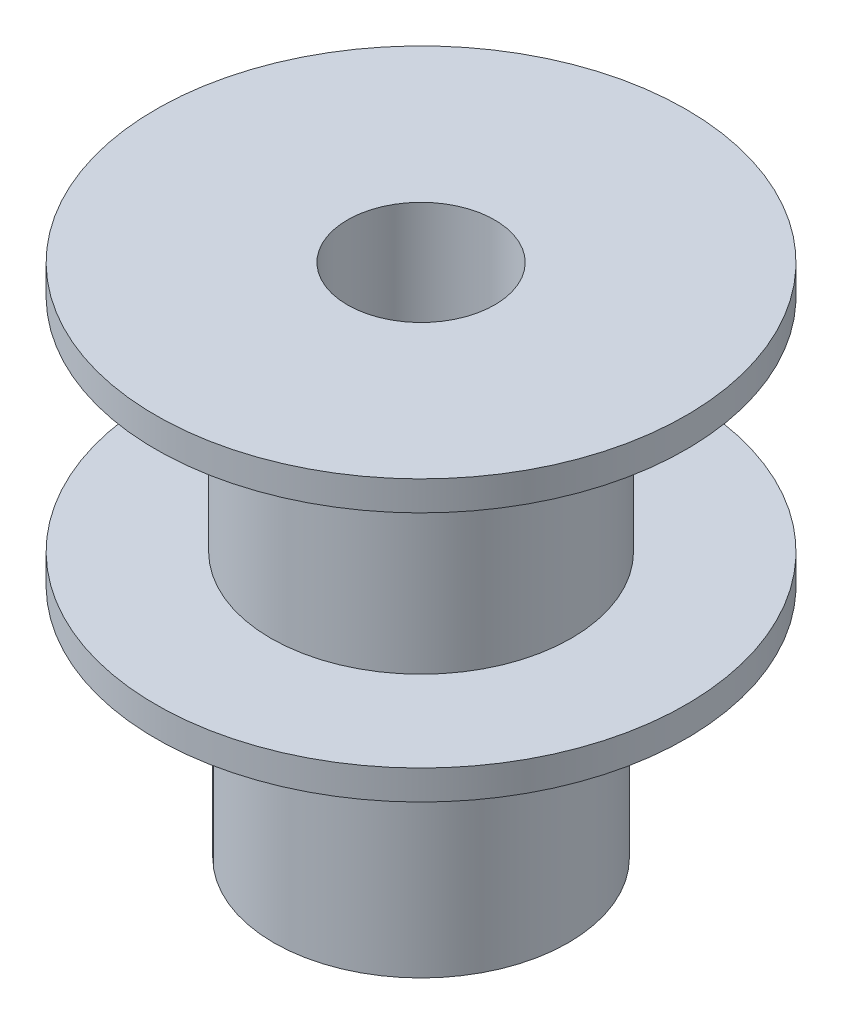
ISO-10303-21;
HEADER;
FILE_DESCRIPTION(('STEP AP214'),'2;1');
FILE_NAME('part.step','',(''),(''),'','','');
FILE_SCHEMA(('AUTOMOTIVE_DESIGN { 1 0 10303 214 1 1 1 1 }'));
ENDSEC;
DATA;
#1=APPLICATION_CONTEXT('core data for automotive mechanical design processes');
#2=APPLICATION_PROTOCOL_DEFINITION('international standard','automotive_design',2000,#1);
#3=PRODUCT_CONTEXT('',#1,'mechanical');
#4=PRODUCT('Part','Part','',(#3));
#5=PRODUCT_RELATED_PRODUCT_CATEGORY('part','',(#4));
#6=PRODUCT_DEFINITION_FORMATION('','',#4);
#7=PRODUCT_DEFINITION_CONTEXT('part definition',#1,'design');
#8=PRODUCT_DEFINITION('design','',#6,#7);
#9=PRODUCT_DEFINITION_SHAPE('','',#8);
#10=(LENGTH_UNIT() NAMED_UNIT(*) SI_UNIT(.MILLI.,.METRE.));
#11=(NAMED_UNIT(*) PLANE_ANGLE_UNIT() SI_UNIT($,.RADIAN.));
#12=(NAMED_UNIT(*) SI_UNIT($,.STERADIAN.) SOLID_ANGLE_UNIT());
#13=UNCERTAINTY_MEASURE_WITH_UNIT(LENGTH_MEASURE(1.E-05),#10,'distance_accuracy_value','');
#14=(GEOMETRIC_REPRESENTATION_CONTEXT(3) GLOBAL_UNCERTAINTY_ASSIGNED_CONTEXT((#13)) GLOBAL_UNIT_ASSIGNED_CONTEXT((#10,
#11,#12)) REPRESENTATION_CONTEXT('',''));
#15=CARTESIAN_POINT('',(0.,0.,0.));
#16=DIRECTION('',(0.,0.,1.));
#17=DIRECTION('',(1.,0.,0.));
#18=AXIS2_PLACEMENT_3D('',#15,#16,#17);
#19=CARTESIAN_POINT('',(5.,0.,0.));
#20=DIRECTION('',(0.,-1.,0.));
#21=DIRECTION('',(0.,0.,-1.));
#22=AXIS2_PLACEMENT_3D('',#19,#20,#21);
#23=PLANE('',#22);
#24=CARTESIAN_POINT('',(0.,0.,0.));
#25=DIRECTION('',(0.,1.,0.));
#26=DIRECTION('',(0.,0.,1.));
#27=AXIS2_PLACEMENT_3D('',#24,#25,#26);
#28=CIRCLE('',#27,2.5);
#29=CARTESIAN_POINT('',(0.,0.,2.5));
#30=VERTEX_POINT('',#29);
#31=EDGE_CURVE('E61',#30,#30,#28,.T.);
#32=ORIENTED_EDGE('',*,*,#31,.T.);
#33=EDGE_LOOP('',(#32));
#34=FACE_BOUND('',#33,.T.);
#35=CARTESIAN_POINT('',(0.,0.,0.));
#36=DIRECTION('',(0.,-1.,0.));
#37=DIRECTION('',(0.,0.,-1.));
#38=AXIS2_PLACEMENT_3D('',#35,#36,#37);
#39=CIRCLE('',#38,5.);
#40=CARTESIAN_POINT('',(0.,0.,-5.));
#41=VERTEX_POINT('',#40);
#42=EDGE_CURVE('E58',#41,#41,#39,.T.);
#43=ORIENTED_EDGE('',*,*,#42,.T.);
#44=EDGE_LOOP('',(#43));
#45=FACE_BOUND('',#44,.T.);
#46=ADVANCED_FACE('F30',(#34,#45),#23,.T.);
#47=CARTESIAN_POINT('',(0.,17.5,0.));
#48=DIRECTION('',(0.,1.,0.));
#49=DIRECTION('',(0.,0.,1.));
#50=AXIS2_PLACEMENT_3D('',#47,#48,#49);
#51=PLANE('',#50);
#52=CARTESIAN_POINT('',(0.,17.5,0.));
#53=DIRECTION('',(0.,1.,0.));
#54=DIRECTION('',(0.,0.,1.));
#55=AXIS2_PLACEMENT_3D('',#52,#53,#54);
#56=CIRCLE('',#55,2.5);
#57=CARTESIAN_POINT('',(0.,17.5,2.5));
#58=VERTEX_POINT('',#57);
#59=EDGE_CURVE('E62',#58,#58,#56,.T.);
#60=ORIENTED_EDGE('',*,*,#59,.F.);
#61=EDGE_LOOP('',(#60));
#62=FACE_BOUND('',#61,.T.);
#63=CARTESIAN_POINT('',(0.,17.5,0.));
#64=DIRECTION('',(0.,-1.,0.));
#65=DIRECTION('',(0.,0.,-1.));
#66=AXIS2_PLACEMENT_3D('',#63,#64,#65);
#67=CIRCLE('',#66,9.);
#68=CARTESIAN_POINT('',(0.,17.5,-9.));
#69=VERTEX_POINT('',#68);
#70=EDGE_CURVE('E10',#69,#69,#67,.T.);
#71=ORIENTED_EDGE('',*,*,#70,.F.);
#72=EDGE_LOOP('',(#71));
#73=FACE_BOUND('',#72,.T.);
#74=ADVANCED_FACE('F115',(#62,#73),#51,.T.);
#75=CARTESIAN_POINT('',(0.,0.,0.));
#76=DIRECTION('',(0.,-1.,0.));
#77=DIRECTION('',(0.,0.,-1.));
#78=AXIS2_PLACEMENT_3D('',#75,#76,#77);
#79=CYLINDRICAL_SURFACE('',#78,9.);
#80=ORIENTED_EDGE('',*,*,#70,.T.);
#81=EDGE_LOOP('',(#80));
#82=FACE_BOUND('',#81,.T.);
#83=CARTESIAN_POINT('',(0.,16.5,0.));
#84=DIRECTION('',(0.,-1.,0.));
#85=DIRECTION('',(0.,0.,-1.));
#86=AXIS2_PLACEMENT_3D('',#83,#84,#85);
#87=CIRCLE('',#86,9.);
#88=CARTESIAN_POINT('',(0.,16.5,-9.));
#89=VERTEX_POINT('',#88);
#90=EDGE_CURVE('E36',#89,#89,#87,.T.);
#91=ORIENTED_EDGE('',*,*,#90,.F.);
#92=EDGE_LOOP('',(#91));
#93=FACE_BOUND('',#92,.T.);
#94=ADVANCED_FACE('F113',(#82,#93),#79,.T.);
#95=CARTESIAN_POINT('',(9.,16.5,0.));
#96=DIRECTION('',(0.,-1.,0.));
#97=DIRECTION('',(0.,0.,-1.));
#98=AXIS2_PLACEMENT_3D('',#95,#96,#97);
#99=PLANE('',#98);
#100=ORIENTED_EDGE('',*,*,#90,.T.);
#101=EDGE_LOOP('',(#100));
#102=FACE_BOUND('',#101,.T.);
#103=CARTESIAN_POINT('',(0.,16.5,0.));
#104=DIRECTION('',(0.,-1.,0.));
#105=DIRECTION('',(0.,0.,-1.));
#106=AXIS2_PLACEMENT_3D('',#103,#104,#105);
#107=CIRCLE('',#106,5.1);
#108=CARTESIAN_POINT('',(0.,16.5,-5.1));
#109=VERTEX_POINT('',#108);
#110=EDGE_CURVE('E40',#109,#109,#107,.T.);
#111=ORIENTED_EDGE('',*,*,#110,.F.);
#112=EDGE_LOOP('',(#111));
#113=FACE_BOUND('',#112,.T.);
#114=ADVANCED_FACE('F109',(#102,#113),#99,.T.);
#115=CARTESIAN_POINT('',(0.,0.,0.));
#116=DIRECTION('',(0.,-1.,0.));
#117=DIRECTION('',(0.,0.,-1.));
#118=AXIS2_PLACEMENT_3D('',#115,#116,#117);
#119=CYLINDRICAL_SURFACE('',#118,5.1);
#120=ORIENTED_EDGE('',*,*,#110,.T.);
#121=EDGE_LOOP('',(#120));
#122=FACE_BOUND('',#121,.T.);
#123=CARTESIAN_POINT('',(0.,9.,0.));
#124=DIRECTION('',(0.,-1.,0.));
#125=DIRECTION('',(0.,0.,-1.));
#126=AXIS2_PLACEMENT_3D('',#123,#124,#125);
#127=CIRCLE('',#126,5.1);
#128=CARTESIAN_POINT('',(0.,9.,-5.1));
#129=VERTEX_POINT('',#128);
#130=EDGE_CURVE('E44',#129,#129,#127,.T.);
#131=ORIENTED_EDGE('',*,*,#130,.F.);
#132=EDGE_LOOP('',(#131));
#133=FACE_BOUND('',#132,.T.);
#134=ADVANCED_FACE('F105',(#122,#133),#119,.T.);
#135=CARTESIAN_POINT('',(5.1,9.,0.));
#136=DIRECTION('',(0.,1.,0.));
#137=DIRECTION('',(0.,0.,1.));
#138=AXIS2_PLACEMENT_3D('',#135,#136,#137);
#139=PLANE('',#138);
#140=ORIENTED_EDGE('',*,*,#130,.T.);
#141=EDGE_LOOP('',(#140));
#142=FACE_BOUND('',#141,.T.);
#143=CARTESIAN_POINT('',(0.,9.,0.));
#144=DIRECTION('',(0.,-1.,0.));
#145=DIRECTION('',(0.,0.,-1.));
#146=AXIS2_PLACEMENT_3D('',#143,#144,#145);
#147=CIRCLE('',#146,9.);
#148=CARTESIAN_POINT('',(0.,9.,-9.));
#149=VERTEX_POINT('',#148);
#150=EDGE_CURVE('E49',#149,#149,#147,.T.);
#151=ORIENTED_EDGE('',*,*,#150,.F.);
#152=EDGE_LOOP('',(#151));
#153=FACE_BOUND('',#152,.T.);
#154=ADVANCED_FACE('F101',(#142,#153),#139,.T.);
#155=CARTESIAN_POINT('',(0.,0.,0.));
#156=DIRECTION('',(0.,-1.,0.));
#157=DIRECTION('',(0.,0.,-1.));
#158=AXIS2_PLACEMENT_3D('',#155,#156,#157);
#159=CYLINDRICAL_SURFACE('',#158,9.);
#160=ORIENTED_EDGE('',*,*,#150,.T.);
#161=EDGE_LOOP('',(#160));
#162=FACE_BOUND('',#161,.T.);
#163=CARTESIAN_POINT('',(0.,8.,0.));
#164=DIRECTION('',(0.,-1.,0.));
#165=DIRECTION('',(0.,0.,-1.));
#166=AXIS2_PLACEMENT_3D('',#163,#164,#165);
#167=CIRCLE('',#166,9.);
#168=CARTESIAN_POINT('',(0.,8.,-9.));
#169=VERTEX_POINT('',#168);
#170=EDGE_CURVE('E52',#169,#169,#167,.T.);
#171=ORIENTED_EDGE('',*,*,#170,.F.);
#172=EDGE_LOOP('',(#171));
#173=FACE_BOUND('',#172,.T.);
#174=ADVANCED_FACE('F97',(#162,#173),#159,.T.);
#175=CARTESIAN_POINT('',(9.,8.,0.));
#176=DIRECTION('',(0.,-1.,0.));
#177=DIRECTION('',(0.,0.,-1.));
#178=AXIS2_PLACEMENT_3D('',#175,#176,#177);
#179=PLANE('',#178);
#180=ORIENTED_EDGE('',*,*,#170,.T.);
#181=EDGE_LOOP('',(#180));
#182=FACE_BOUND('',#181,.T.);
#183=CARTESIAN_POINT('',(0.,8.,0.));
#184=DIRECTION('',(0.,-1.,0.));
#185=DIRECTION('',(0.,0.,-1.));
#186=AXIS2_PLACEMENT_3D('',#183,#184,#185);
#187=CIRCLE('',#186,5.);
#188=CARTESIAN_POINT('',(0.,8.,-5.));
#189=VERTEX_POINT('',#188);
#190=EDGE_CURVE('E55',#189,#189,#187,.T.);
#191=ORIENTED_EDGE('',*,*,#190,.F.);
#192=EDGE_LOOP('',(#191));
#193=FACE_BOUND('',#192,.T.);
#194=ADVANCED_FACE('F93',(#182,#193),#179,.T.);
#195=CARTESIAN_POINT('',(0.,0.,0.));
#196=DIRECTION('',(0.,-1.,0.));
#197=DIRECTION('',(0.,0.,-1.));
#198=AXIS2_PLACEMENT_3D('',#195,#196,#197);
#199=CYLINDRICAL_SURFACE('',#198,5.);
#200=CARTESIAN_POINT('',(-4.76969600708473,4.,-1.5));
#201=CARTESIAN_POINT('',(-4.7696968572698,4.0821945479424,-1.49999897633764));
#202=CARTESIAN_POINT('',(-4.77184390209069,4.16439922414402,-1.49322108167142));
#203=CARTESIAN_POINT('',(-4.780165783029,4.32640524959194,-1.46635844446749));
#204=CARTESIAN_POINT('',(-4.78634196493468,4.40620578650147,-1.44626925573578));
#205=CARTESIAN_POINT('',(-4.80196102485632,4.56103472827173,-1.39352753269955));
#206=CARTESIAN_POINT('',(-4.81139846703232,4.63607082963309,-1.36089589394243));
#207=CARTESIAN_POINT('',(-4.83246932547567,4.7796219339953,-1.28406421917929));
#208=CARTESIAN_POINT('',(-4.84410307041019,4.84813595868444,-1.23986245137053));
#209=CARTESIAN_POINT('',(-4.86866862185765,4.97886639057737,-1.13964754141627));
#210=CARTESIAN_POINT('',(-4.88162808311636,5.04084589794629,-1.08333207175807));
#211=CARTESIAN_POINT('',(-4.90714861936757,5.15463795132251,-0.961136237579599));
#212=CARTESIAN_POINT('',(-4.91970964297705,5.20644919044988,-0.895254645461111));
#213=CARTESIAN_POINT('',(-4.94333214579389,5.29946269983331,-0.75411143779369));
#214=CARTESIAN_POINT('',(-4.95435724342404,5.34042342444281,-0.678684021335814));
#215=CARTESIAN_POINT('',(-4.97334435920684,5.40898725904276,-0.521624645369353));
#216=CARTESIAN_POINT('',(-4.98130703789495,5.43659324985745,-0.439994028387911));
#217=CARTESIAN_POINT('',(-4.99307646003589,5.47688000109051,-0.275323852630829));
#218=CARTESIAN_POINT('',(-4.99699557369338,5.4899651276527,-0.192391398953801));
#219=CARTESIAN_POINT('',(-5.00063201501348,5.50211732464644,-0.0254218237493147));
#220=CARTESIAN_POINT('',(-5.00035022521079,5.50118733940196,0.0586150620503685));
#221=CARTESIAN_POINT('',(-4.99569603817658,5.48560713145698,0.22257115660016));
#222=CARTESIAN_POINT('',(-4.9914542020526,5.47139480619013,0.302536267641342));
#223=CARTESIAN_POINT('',(-4.97951522112593,5.43036866400571,0.458889213442527));
#224=CARTESIAN_POINT('',(-4.97181785750586,5.40355404905733,0.535276821322846));
#225=CARTESIAN_POINT('',(-4.95365220986963,5.33778797658144,0.683347326351281));
#226=CARTESIAN_POINT('',(-4.94315269676706,5.29869879719273,0.754965064694478));
#227=CARTESIAN_POINT('',(-4.92049640648069,5.20960214757177,0.890764673783156));
#228=CARTESIAN_POINT('',(-4.90833923637778,5.15959208703652,0.954944774872131));
#229=CARTESIAN_POINT('',(-4.88311550488165,5.0478022492484,1.0766604815298));
#230=CARTESIAN_POINT('',(-4.87003195321461,4.98564308097026,1.13384458040111));
#231=CARTESIAN_POINT('',(-4.84483979887497,4.85248998210995,1.23707651539824));
#232=CARTESIAN_POINT('',(-4.8327312931702,4.78149517461077,1.28312324482853));
#233=CARTESIAN_POINT('',(-4.81077903197678,4.63176053075101,1.3631399533545));
#234=CARTESIAN_POINT('',(-4.80095810695957,4.55295295413708,1.39698989237679));
#235=CARTESIAN_POINT('',(-4.78496392548436,4.39039279155446,1.45083362878413));
#236=CARTESIAN_POINT('',(-4.7787894791583,4.30664182846544,1.4708319464056));
#237=CARTESIAN_POINT('',(-4.77104849541241,4.13991763926072,1.49574770282165));
#238=CARTESIAN_POINT('',(-4.7693187867044,4.05703177610602,1.50119946380212));
#239=CARTESIAN_POINT('',(-4.77021192441924,3.89152709999013,1.49835947233062));
#240=CARTESIAN_POINT('',(-4.77283416156589,3.80890825126915,1.4900696437133));
#241=CARTESIAN_POINT('',(-4.78197558554912,3.64851162202913,1.4604576357419));
#242=CARTESIAN_POINT('',(-4.78839176507489,3.57066383573648,1.4394796143128));
#243=CARTESIAN_POINT('',(-4.80429141231227,3.41959830918508,1.3854857774794));
#244=CARTESIAN_POINT('',(-4.81377535359073,3.34638128585943,1.3524681034276));
#245=CARTESIAN_POINT('',(-4.83505835023047,3.20448253592787,1.274318711965));
#246=CARTESIAN_POINT('',(-4.84691271069799,3.13597527901421,1.22888564172729));
#247=CARTESIAN_POINT('',(-4.87148205646987,3.0073618938192,1.12755301600385));
#248=CARTESIAN_POINT('',(-4.88419724730003,2.94725778238721,1.07165095534897));
#249=CARTESIAN_POINT('',(-4.90963633548158,2.83481959418526,0.948455132493599));
#250=CARTESIAN_POINT('',(-4.92234245063004,2.78286437101302,0.880811065857435));
#251=CARTESIAN_POINT('',(-4.9458485174865,2.69103329897225,0.73746178459025));
#252=CARTESIAN_POINT('',(-4.95664856384717,2.65115685021854,0.661756970543944));
#253=CARTESIAN_POINT('',(-4.97505970474957,2.5849999694317,0.504935504705221));
#254=CARTESIAN_POINT('',(-4.98269453424965,2.55861798384102,0.423864622037838));
#255=CARTESIAN_POINT('',(-4.99401979596827,2.51993908110958,0.258169966504588));
#256=CARTESIAN_POINT('',(-4.9977113567088,2.50763813405158,0.173547217354762));
#257=CARTESIAN_POINT('',(-5.00066544081399,2.4977769559455,0.00665215388274292));
#258=CARTESIAN_POINT('',(-5.00009305111322,2.49966730459217,-0.0755851790862063));
#259=CARTESIAN_POINT('',(-4.99497264465036,2.51682163249912,-0.238519481164403));
#260=CARTESIAN_POINT('',(-4.99042485330462,2.53208485348044,-0.319216537346528));
#261=CARTESIAN_POINT('',(-4.97791168358326,2.57521166139962,-0.475935813041358));
#262=CARTESIAN_POINT('',(-4.96998352900866,2.60293818064901,-0.551998927351391));
#263=CARTESIAN_POINT('',(-4.9515294303945,2.67008191450719,-0.698433237752053));
#264=CARTESIAN_POINT('',(-4.94100305949946,2.70950105028619,-0.768803496050579));
#265=CARTESIAN_POINT('',(-4.91803965828228,2.80037345743004,-0.904301892420563));
#266=CARTESIAN_POINT('',(-4.90555226923559,2.85217143000077,-0.969190250076766));
#267=CARTESIAN_POINT('',(-4.88023537212334,2.9657103883328,-1.08953757134594));
#268=CARTESIAN_POINT('',(-4.86740576641079,3.02745423789815,-1.14499380960193));
#269=CARTESIAN_POINT('',(-4.84240680631319,3.16134077831051,-1.24656269394549));
#270=CARTESIAN_POINT('',(-4.83026852693485,3.23373855339044,-1.29234759757956));
#271=CARTESIAN_POINT('',(-4.80852547508793,3.38555517416102,-1.37104313528776));
#272=CARTESIAN_POINT('',(-4.79891948596955,3.46497062360119,-1.40395995557289));
#273=CARTESIAN_POINT('',(-4.78427816717594,3.61974043160627,-1.4530194253295));
#274=CARTESIAN_POINT('',(-4.7788615484052,3.69460864693099,-1.47058859011232));
#275=CARTESIAN_POINT('',(-4.77157042597167,3.84631522249577,-1.49407818835144));
#276=CARTESIAN_POINT('',(-4.7696952122143,3.92315318464525,-1.50000095706095));
#277=CARTESIAN_POINT('',(-4.76969600708473,4.,-1.5));
#278=B_SPLINE_CURVE_WITH_KNOTS('',3,(#200,#201,#202,#203,#204,#205,#206,#207,#208,#209,#210,
#211,#212,#213,#214,#215,#216,#217,#218,#219,#220,#221,#222,#223,#224,#225,#226,#227,#228,#229,
#230,#231,#232,#233,#234,#235,#236,#237,#238,#239,#240,#241,#242,#243,#244,#245,#246,#247,#248,
#249,#250,#251,#252,#253,#254,#255,#256,#257,#258,#259,#260,#261,#262,#263,#264,#265,#266,#267,
#268,#269,#270,#271,#272,#273,#274,#275,#276,#277),.UNSPECIFIED.,.T.,.F.,(4,2,2,2,2,2,2,2,2,2,2,
2,2,2,2,2,2,2,2,2,2,2,2,2,2,2,2,2,2,2,2,2,2,2,2,2,2,2,4),(0.,0.246300165915542,0.492682641689,
0.738656414466193,0.984667025370101,1.23773150007984,1.49082847871273,1.74915939273645,
2.00743455587877,2.25832140149558,2.5091555410144,2.7520012599088,2.99486235890376,
3.24055209335676,3.4863001659083,3.74152147023278,3.99676812491863,4.25446238246266,
4.51207250628411,4.76008080790309,5.00805439107387,5.24958594938817,5.49115481045787,
5.73920731809388,5.98731925928923,6.24479506100602,6.50225807324202,6.75775391814325,
7.01317662321682,7.2587630391122,7.50433553047754,7.74727096872219,7.99024634491378,
8.24099627054488,8.4918185262989,8.75011639669147,9.00828993963944,9.23861153857448,
9.4688869503356),.UNSPECIFIED.);
#279=CARTESIAN_POINT('',(-4.76969600708473,4.,-1.5));
#280=VERTEX_POINT('',#279);
#281=EDGE_CURVE('E68',#280,#280,#278,.T.);
#282=ORIENTED_EDGE('',*,*,#281,.T.);
#283=EDGE_LOOP('',(#282));
#284=FACE_BOUND('',#283,.T.);
#285=ORIENTED_EDGE('',*,*,#190,.T.);
#286=EDGE_LOOP('',(#285));
#287=FACE_BOUND('',#286,.T.);
#288=ORIENTED_EDGE('',*,*,#42,.F.);
#289=EDGE_LOOP('',(#288));
#290=FACE_BOUND('',#289,.T.);
#291=ADVANCED_FACE('F89',(#284,#287,#290),#199,.T.);
#292=CARTESIAN_POINT('',(0.,0.,0.));
#293=DIRECTION('',(0.,1.,0.));
#294=DIRECTION('',(0.,0.,1.));
#295=AXIS2_PLACEMENT_3D('',#292,#293,#294);
#296=CYLINDRICAL_SURFACE('',#295,2.5);
#297=CARTESIAN_POINT('',(-2.,4.,-1.5));
#298=CARTESIAN_POINT('',(-1.99999416642511,4.07547897528964,-1.50000404108592));
#299=CARTESIAN_POINT('',(-2.00433633903481,4.1509384340798,-1.49426852824014));
#300=CARTESIAN_POINT('',(-2.02092590613883,4.29932390396222,-1.47174965152787));
#301=CARTESIAN_POINT('',(-2.03318155043097,4.3722471873851,-1.45495475788936));
#302=CARTESIAN_POINT('',(-2.0636233903473,4.51308364167728,-1.41143486335795));
#303=CARTESIAN_POINT('',(-2.0817666618312,4.58102883803527,-1.3847815450315));
#304=CARTESIAN_POINT('',(-2.12185904995836,4.71143745336792,-1.32252909283019));
#305=CARTESIAN_POINT('',(-2.14380930122416,4.77389922969514,-1.28692729054693));
#306=CARTESIAN_POINT('',(-2.19228594587542,4.89994901666408,-1.20271292747644));
#307=CARTESIAN_POINT('',(-2.21904371037662,4.96274095712394,-1.15304179435289));
#308=CARTESIAN_POINT('',(-2.27226229431061,5.07976476274175,-1.04426801309985));
#309=CARTESIAN_POINT('',(-2.29872287517103,5.1339901516708,-0.985158296729614));
#310=CARTESIAN_POINT('',(-2.35175567858734,5.2381338097097,-0.851442367411703));
#311=CARTESIAN_POINT('',(-2.37803133577818,5.28695446366975,-0.775851995162548));
#312=CARTESIAN_POINT('',(-2.42443786983179,5.37080972244443,-0.615654228271659));
#313=CARTESIAN_POINT('',(-2.44457437988735,5.40585697412271,-0.531055196626331));
#314=CARTESIAN_POINT('',(-2.4747098780044,5.45759592281265,-0.363771406742667));
#315=CARTESIAN_POINT('',(-2.4854930393917,5.4757203609673,-0.281674698130915));
#316=CARTESIAN_POINT('',(-2.49874939277545,5.49794280286312,-0.114970509382708));
#317=CARTESIAN_POINT('',(-2.50123038813307,5.50205397800006,-0.0303654624001536));
#318=CARTESIAN_POINT('',(-2.49783372711539,5.49638625265754,0.12763728373731));
#319=CARTESIAN_POINT('',(-2.49295437513726,5.48826647383069,0.201123832865635));
#320=CARTESIAN_POINT('',(-2.47707997553857,5.46152020435189,0.345464269151768));
#321=CARTESIAN_POINT('',(-2.46608447529309,5.44289293609285,0.416317961051202));
#322=CARTESIAN_POINT('',(-2.43884907201719,5.39583443729622,0.55405678046908));
#323=CARTESIAN_POINT('',(-2.42257910450824,5.367346938861,0.620916491037618));
#324=CARTESIAN_POINT('',(-2.38609637638748,5.30161538377446,0.748988660115611));
#325=CARTESIAN_POINT('',(-2.36588259201812,5.26436905294099,0.810199646208011));
#326=CARTESIAN_POINT('',(-2.32037925976363,5.17716090719555,0.933074267143199));
#327=CARTESIAN_POINT('',(-2.2947718295215,5.12621168826426,0.993918663198193));
#328=CARTESIAN_POINT('',(-2.24255554245601,5.01559588213983,1.10671465909275));
#329=CARTESIAN_POINT('',(-2.21594536703375,4.95591749652549,1.1586540130834));
#330=CARTESIAN_POINT('',(-2.16111075123946,4.82134659383645,1.25824837767417));
#331=CARTESIAN_POINT('',(-2.13305661385124,4.74549242346054,1.30470933188632));
#332=CARTESIAN_POINT('',(-2.08250879557267,4.58529376836339,1.38397217194232));
#333=CARTESIAN_POINT('',(-2.0600049029882,4.50096528387436,1.41679921962189));
#334=CARTESIAN_POINT('',(-2.02895865196731,4.34760636810465,1.46077497064842));
#335=CARTESIAN_POINT('',(-2.01833888618316,4.27995936770336,1.47527903312665));
#336=CARTESIAN_POINT('',(-2.00392150777558,4.14262638970052,1.49480872755284));
#337=CARTESIAN_POINT('',(-2.00011596115116,4.07294287951544,1.49984538302907));
#338=CARTESIAN_POINT('',(-1.99988914321323,3.93344831756429,1.50014781114183));
#339=CARTESIAN_POINT('',(-2.00347810223984,3.86363722278479,1.49540004697659));
#340=CARTESIAN_POINT('',(-2.01751520788652,3.72601265625144,1.47640290574941));
#341=CARTESIAN_POINT('',(-2.02796877613213,3.65820080775975,1.46214601830139));
#342=CARTESIAN_POINT('',(-2.054317683331,3.52628542052022,1.42488312618657));
#343=CARTESIAN_POINT('',(-2.07020622092812,3.46217736346777,1.40188805257362));
#344=CARTESIAN_POINT('',(-2.10571539417587,3.33852228426982,1.34796261057072));
#345=CARTESIAN_POINT('',(-2.12533743689999,3.278976993634,1.31702924888212));
#346=CARTESIAN_POINT('',(-2.17036819177736,3.15475991748776,1.24167439558512));
#347=CARTESIAN_POINT('',(-2.19618239397369,3.09109916490343,1.19582663060303));
#348=CARTESIAN_POINT('',(-2.2482175480362,2.97171451515054,1.09487395518701));
#349=CARTESIAN_POINT('',(-2.27443886711455,2.91599830783088,1.03976018672402));
#350=CARTESIAN_POINT('',(-2.32835625910913,2.80677599264957,0.913274837212769));
#351=CARTESIAN_POINT('',(-2.3558007587587,2.75449927339416,0.840721108780194));
#352=CARTESIAN_POINT('',(-2.40537639133459,2.66309722316335,0.686103100868022));
#353=CARTESIAN_POINT('',(-2.4275110444941,2.62396317215908,0.604045176134705));
#354=CARTESIAN_POINT('',(-2.46252280092775,2.56313179656863,0.438840232972141));
#355=CARTESIAN_POINT('',(-2.47595588067329,2.54037377220889,0.35620596365126));
#356=CARTESIAN_POINT('',(-2.494407389061,2.50928539715374,0.187383063890859));
#357=CARTESIAN_POINT('',(-2.49943534582737,2.50093870928238,0.101198571781971));
#358=CARTESIAN_POINT('',(-2.50040600461976,2.49932539141407,-0.0598120232009816));
#359=CARTESIAN_POINT('',(-2.49747057186327,2.50419666543697,-0.134620583589704));
#360=CARTESIAN_POINT('',(-2.48512948412096,2.52489382438161,-0.282148755978771));
#361=CARTESIAN_POINT('',(-2.47572375706639,2.5407198313216,-0.354868344701912));
#362=CARTESIAN_POINT('',(-2.45149427526962,2.58221957158378,-0.495145481978795));
#363=CARTESIAN_POINT('',(-2.43675966858906,2.60773159612924,-0.562767032608828));
#364=CARTESIAN_POINT('',(-2.40303337447155,2.66764059455475,-0.692781971999982));
#365=CARTESIAN_POINT('',(-2.38404073252268,2.7020395608596,-0.75517418419983));
#366=CARTESIAN_POINT('',(-2.34093432659381,2.78292519656876,-0.880263645295945));
#367=CARTESIAN_POINT('',(-2.31648844639149,2.83031870901686,-0.942258690439938));
#368=CARTESIAN_POINT('',(-2.26601907350661,2.93375303371772,-1.05789751536306));
#369=CARTESIAN_POINT('',(-2.23999385274509,2.98980342560791,-1.11153190956915));
#370=CARTESIAN_POINT('',(-2.18528165666205,3.1172855621777,-1.2159097535057));
#371=CARTESIAN_POINT('',(-2.15667566270901,3.1897664861655,-1.26542406663367));
#372=CARTESIAN_POINT('',(-2.10376464485145,3.34348485276654,-1.35156817210325));
#373=CARTESIAN_POINT('',(-2.07945738811052,3.42471771398141,-1.38820466322661));
#374=CARTESIAN_POINT('',(-2.0408000304796,3.5870642851372,-1.44437116535132));
#375=CARTESIAN_POINT('',(-2.02577665830138,3.66759523596124,-1.46509526060187));
#376=CARTESIAN_POINT('',(-2.00539032320036,3.83209739470368,-1.49289268240426));
#377=CARTESIAN_POINT('',(-2.00000648744643,3.91606076575871,-1.49999550595837));
#378=CARTESIAN_POINT('',(-2.,4.,-1.5));
#379=B_SPLINE_CURVE_WITH_KNOTS('',3,(#297,#298,#299,#300,#301,#302,#303,#304,#305,#306,#307,
#308,#309,#310,#311,#312,#313,#314,#315,#316,#317,#318,#319,#320,#321,#322,#323,#324,#325,#326,
#327,#328,#329,#330,#331,#332,#333,#334,#335,#336,#337,#338,#339,#340,#341,#342,#343,#344,#345,
#346,#347,#348,#349,#350,#351,#352,#353,#354,#355,#356,#357,#358,#359,#360,#361,#362,#363,#364,
#365,#366,#367,#368,#369,#370,#371,#372,#373,#374,#375,#376,#377,#378),.UNSPECIFIED.,.T.,.F.,(4,
2,2,2,2,2,2,2,2,2,2,2,2,2,2,2,2,2,2,2,2,2,2,2,2,2,2,2,2,2,2,2,2,2,2,2,2,2,2,2,4),(0.,
0.226085249493392,0.45240657433077,0.677113624991875,0.901887762215931,1.15414462390001,
1.40659128601844,1.68630157736223,1.9657544327122,2.21853330858497,2.47107452602766,
2.69230130543182,2.91354445887944,3.13607155036377,3.35865648368878,3.60782810055849,
3.85733966656908,4.13576671140276,4.41367760154768,4.62276298054684,4.83160475643976,
5.04073566011181,5.25003193304128,5.45906724365495,5.6681814915466,5.91499438482002,
6.16204457978454,6.44121828011588,6.72020638384847,6.97891479383337,7.23732973022726,
7.46129321849399,7.68525920139648,7.90563970188756,8.12606965394584,8.37042963549487,
8.61506198741954,8.89071695766603,9.16622832484805,9.41820120134353,9.66962780912277),.UNSPECIFIED.);
#380=CARTESIAN_POINT('',(-2.,4.,-1.5));
#381=VERTEX_POINT('',#380);
#382=EDGE_CURVE('E65',#381,#381,#379,.T.);
#383=ORIENTED_EDGE('',*,*,#382,.F.);
#384=EDGE_LOOP('',(#383));
#385=FACE_BOUND('',#384,.T.);
#386=ORIENTED_EDGE('',*,*,#31,.F.);
#387=EDGE_LOOP('',(#386));
#388=FACE_BOUND('',#387,.T.);
#389=ORIENTED_EDGE('',*,*,#59,.T.);
#390=EDGE_LOOP('',(#389));
#391=FACE_BOUND('',#390,.T.);
#392=ADVANCED_FACE('F84',(#385,#388,#391),#296,.F.);
#393=CARTESIAN_POINT('',(-9.001,4.,0.));
#394=DIRECTION('',(1.,0.,0.));
#395=DIRECTION('',(0.,0.,-1.));
#396=AXIS2_PLACEMENT_3D('',#393,#394,#395);
#397=CYLINDRICAL_SURFACE('',#396,1.5);
#398=ORIENTED_EDGE('',*,*,#281,.F.);
#399=EDGE_LOOP('',(#398));
#400=FACE_BOUND('',#399,.T.);
#401=ORIENTED_EDGE('',*,*,#382,.T.);
#402=EDGE_LOOP('',(#401));
#403=FACE_BOUND('',#402,.T.);
#404=ADVANCED_FACE('F78',(#400,#403),#397,.F.);
#405=CLOSED_SHELL('',(#46,#74,#94,#114,#134,#154,#174,#194,#291,#392,#404));
#406=MANIFOLD_SOLID_BREP('B2',#405);
#407=ADVANCED_BREP_SHAPE_REPRESENTATION('',(#18,#406),#14);
#408=SHAPE_DEFINITION_REPRESENTATION(#9,#407);
ENDSEC;
END-ISO-10303-21;
